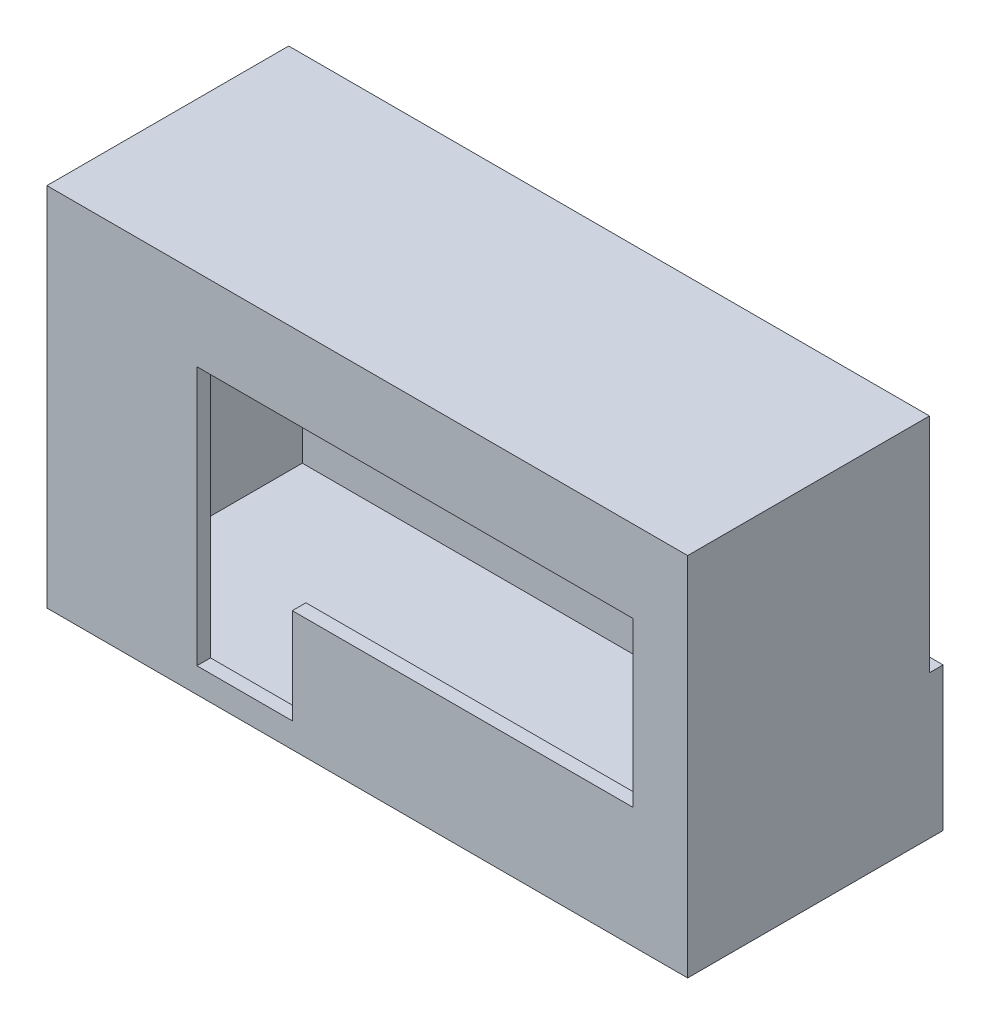
ISO-10303-21;
HEADER;
FILE_DESCRIPTION(('STEP AP214'),'2;1');
FILE_NAME('part.step','',(''),(''),'','','');
FILE_SCHEMA(('AUTOMOTIVE_DESIGN { 1 0 10303 214 1 1 1 1 }'));
ENDSEC;
DATA;
#1=APPLICATION_CONTEXT('core data for automotive mechanical design processes');
#2=APPLICATION_PROTOCOL_DEFINITION('international standard','automotive_design',2000,#1);
#3=PRODUCT_CONTEXT('',#1,'mechanical');
#4=PRODUCT('Part','Part','',(#3));
#5=PRODUCT_RELATED_PRODUCT_CATEGORY('part','',(#4));
#6=PRODUCT_DEFINITION_FORMATION('','',#4);
#7=PRODUCT_DEFINITION_CONTEXT('part definition',#1,'design');
#8=PRODUCT_DEFINITION('design','',#6,#7);
#9=PRODUCT_DEFINITION_SHAPE('','',#8);
#10=(LENGTH_UNIT() NAMED_UNIT(*) SI_UNIT(.MILLI.,.METRE.));
#11=(NAMED_UNIT(*) PLANE_ANGLE_UNIT() SI_UNIT($,.RADIAN.));
#12=(NAMED_UNIT(*) SI_UNIT($,.STERADIAN.) SOLID_ANGLE_UNIT());
#13=UNCERTAINTY_MEASURE_WITH_UNIT(LENGTH_MEASURE(1.E-05),#10,'distance_accuracy_value','');
#14=(GEOMETRIC_REPRESENTATION_CONTEXT(3) GLOBAL_UNCERTAINTY_ASSIGNED_CONTEXT((#13)) GLOBAL_UNIT_ASSIGNED_CONTEXT((#10,
#11,#12)) REPRESENTATION_CONTEXT('',''));
#15=CARTESIAN_POINT('',(0.,0.,0.));
#16=DIRECTION('',(0.,0.,1.));
#17=DIRECTION('',(1.,0.,0.));
#18=AXIS2_PLACEMENT_3D('',#15,#16,#17);
#19=CARTESIAN_POINT('',(-4500.,0.,-1673.50441924756));
#20=DIRECTION('',(0.,0.,1.));
#21=DIRECTION('',(1.,0.,0.));
#22=AXIS2_PLACEMENT_3D('',#19,#20,#21);
#23=PLANE('',#22);
#24=DIRECTION('',(1.,0.,0.));
#25=VECTOR('',#24,1.);
#26=CARTESIAN_POINT('',(100.,968.780178406409,-1673.50441924756));
#27=LINE('',#26,#25);
#28=CARTESIAN_POINT('',(-4600.,968.78017840641,-1673.50441924756));
#29=VERTEX_POINT('',#28);
#30=CARTESIAN_POINT('',(-4500.,968.78017840641,-1673.50441924756));
#31=VERTEX_POINT('',#30);
#32=EDGE_CURVE('E52',#29,#31,#27,.T.);
#33=ORIENTED_EDGE('',*,*,#32,.F.);
#34=DIRECTION('',(0.,-1.,0.));
#35=VECTOR('',#34,1.);
#36=CARTESIAN_POINT('',(-4600.,2500.,-1673.50441924756));
#37=LINE('',#36,#35);
#38=CARTESIAN_POINT('',(-4600.,2600.,-1673.50441924756));
#39=VERTEX_POINT('',#38);
#40=EDGE_CURVE('E226',#39,#29,#37,.T.);
#41=ORIENTED_EDGE('',*,*,#40,.F.);
#42=DIRECTION('',(-1.,0.,0.));
#43=VECTOR('',#42,1.);
#44=CARTESIAN_POINT('',(-4600.,2600.,-1673.50441924756));
#45=LINE('',#44,#43);
#46=CARTESIAN_POINT('',(100.,2600.,-1673.50441924756));
#47=VERTEX_POINT('',#46);
#48=EDGE_CURVE('E216',#47,#39,#45,.T.);
#49=ORIENTED_EDGE('',*,*,#48,.F.);
#50=DIRECTION('',(0.,1.,0.));
#51=VECTOR('',#50,1.);
#52=CARTESIAN_POINT('',(100.,2500.,-1673.50441924756));
#53=LINE('',#52,#51);
#54=CARTESIAN_POINT('',(100.,968.780178406409,-1673.50441924756));
#55=VERTEX_POINT('',#54);
#56=EDGE_CURVE('E172',#55,#47,#53,.T.);
#57=ORIENTED_EDGE('',*,*,#56,.F.);
#58=CARTESIAN_POINT('',(0.,968.780178406409,-1673.50441924756));
#59=VERTEX_POINT('',#58);
#60=EDGE_CURVE('E11',#59,#55,#27,.T.);
#61=ORIENTED_EDGE('',*,*,#60,.F.);
#62=DIRECTION('',(0.,1.,0.));
#63=VECTOR('',#62,1.);
#64=CARTESIAN_POINT('',(0.,2500.,-1673.50441924756));
#65=LINE('',#64,#63);
#66=CARTESIAN_POINT('',(0.,2500.,-1673.50441924756));
#67=VERTEX_POINT('',#66);
#68=EDGE_CURVE('E234',#59,#67,#65,.T.);
#69=ORIENTED_EDGE('',*,*,#68,.T.);
#70=DIRECTION('',(-1.,0.,0.));
#71=VECTOR('',#70,1.);
#72=CARTESIAN_POINT('',(-4600.,2500.,-1673.50441924756));
#73=LINE('',#72,#71);
#74=CARTESIAN_POINT('',(-4500.,2500.,-1673.50441924756));
#75=VERTEX_POINT('',#74);
#76=EDGE_CURVE('E203',#67,#75,#73,.T.);
#77=ORIENTED_EDGE('',*,*,#76,.T.);
#78=DIRECTION('',(0.,-1.,0.));
#79=VECTOR('',#78,1.);
#80=CARTESIAN_POINT('',(-4500.,2500.,-1673.50441924756));
#81=LINE('',#80,#79);
#82=EDGE_CURVE('E235',#75,#31,#81,.T.);
#83=ORIENTED_EDGE('',*,*,#82,.T.);
#84=EDGE_LOOP('',(#33,#41,#49,#57,#61,#69,#77,#83));
#85=FACE_BOUND('',#84,.T.);
#86=ADVANCED_FACE('F41',(#85),#23,.F.);
#87=CARTESIAN_POINT('',(0.,2000.,100.));
#88=DIRECTION('',(0.,1.,0.));
#89=DIRECTION('',(0.,0.,1.));
#90=AXIS2_PLACEMENT_3D('',#87,#88,#89);
#91=PLANE('',#90);
#92=DIRECTION('',(1.,0.,0.));
#93=VECTOR('',#92,1.);
#94=CARTESIAN_POINT('',(0.,2000.,0.));
#95=LINE('',#94,#93);
#96=CARTESIAN_POINT('',(-3500.,2000.,0.));
#97=VERTEX_POINT('',#96);
#98=CARTESIAN_POINT('',(-300.,2000.,0.));
#99=VERTEX_POINT('',#98);
#100=EDGE_CURVE('E307',#97,#99,#95,.T.);
#101=ORIENTED_EDGE('',*,*,#100,.T.);
#102=DIRECTION('',(0.,0.,-1.));
#103=VECTOR('',#102,1.);
#104=CARTESIAN_POINT('',(-300.,2000.,100.));
#105=LINE('',#104,#103);
#106=CARTESIAN_POINT('',(-300.,2000.,100.));
#107=VERTEX_POINT('',#106);
#108=EDGE_CURVE('E45',#107,#99,#105,.T.);
#109=ORIENTED_EDGE('',*,*,#108,.F.);
#110=DIRECTION('',(1.,0.,0.));
#111=VECTOR('',#110,1.);
#112=CARTESIAN_POINT('',(0.,2000.,100.));
#113=LINE('',#112,#111);
#114=CARTESIAN_POINT('',(-3500.,2000.,100.));
#115=VERTEX_POINT('',#114);
#116=EDGE_CURVE('E269',#115,#107,#113,.T.);
#117=ORIENTED_EDGE('',*,*,#116,.F.);
#118=DIRECTION('',(0.,0.,-1.));
#119=VECTOR('',#118,1.);
#120=CARTESIAN_POINT('',(-3500.,2000.,100.));
#121=LINE('',#120,#119);
#122=EDGE_CURVE('E292',#115,#97,#121,.T.);
#123=ORIENTED_EDGE('',*,*,#122,.T.);
#124=EDGE_LOOP('',(#101,#109,#117,#123));
#125=FACE_BOUND('',#124,.T.);
#126=ADVANCED_FACE('F43',(#125),#91,.F.);
#127=CARTESIAN_POINT('',(-300.,0.,100.));
#128=DIRECTION('',(1.,0.,0.));
#129=DIRECTION('',(0.,0.,-1.));
#130=AXIS2_PLACEMENT_3D('',#127,#128,#129);
#131=PLANE('',#130);
#132=DIRECTION('',(0.,-1.,0.));
#133=VECTOR('',#132,1.);
#134=CARTESIAN_POINT('',(-300.,0.,0.));
#135=LINE('',#134,#133);
#136=CARTESIAN_POINT('',(-300.,800.,0.));
#137=VERTEX_POINT('',#136);
#138=EDGE_CURVE('E311',#99,#137,#135,.T.);
#139=ORIENTED_EDGE('',*,*,#138,.T.);
#140=DIRECTION('',(0.,0.,-1.));
#141=VECTOR('',#140,1.);
#142=CARTESIAN_POINT('',(-300.,800.,100.));
#143=LINE('',#142,#141);
#144=CARTESIAN_POINT('',(-300.,800.,100.));
#145=VERTEX_POINT('',#144);
#146=EDGE_CURVE('E340',#145,#137,#143,.T.);
#147=ORIENTED_EDGE('',*,*,#146,.F.);
#148=DIRECTION('',(0.,-1.,0.));
#149=VECTOR('',#148,1.);
#150=CARTESIAN_POINT('',(-300.,0.,100.));
#151=LINE('',#150,#149);
#152=EDGE_CURVE('E273',#107,#145,#151,.T.);
#153=ORIENTED_EDGE('',*,*,#152,.F.);
#154=ORIENTED_EDGE('',*,*,#108,.T.);
#155=EDGE_LOOP('',(#139,#147,#153,#154));
#156=FACE_BOUND('',#155,.T.);
#157=ADVANCED_FACE('F349',(#156),#131,.F.);
#158=CARTESIAN_POINT('',(0.,800.,100.));
#159=DIRECTION('',(0.,1.,0.));
#160=DIRECTION('',(0.,0.,1.));
#161=AXIS2_PLACEMENT_3D('',#158,#159,#160);
#162=PLANE('',#161);
#163=DIRECTION('',(1.,0.,0.));
#164=VECTOR('',#163,1.);
#165=CARTESIAN_POINT('',(0.,800.,0.));
#166=LINE('',#165,#164);
#167=CARTESIAN_POINT('',(-2800.,800.,0.));
#168=VERTEX_POINT('',#167);
#169=EDGE_CURVE('E315',#168,#137,#166,.T.);
#170=ORIENTED_EDGE('',*,*,#169,.F.);
#171=DIRECTION('',(0.,0.,-1.));
#172=VECTOR('',#171,1.);
#173=CARTESIAN_POINT('',(-2800.,800.,100.));
#174=LINE('',#173,#172);
#175=CARTESIAN_POINT('',(-2800.,800.,100.));
#176=VERTEX_POINT('',#175);
#177=EDGE_CURVE('E338',#176,#168,#174,.T.);
#178=ORIENTED_EDGE('',*,*,#177,.F.);
#179=DIRECTION('',(1.,0.,0.));
#180=VECTOR('',#179,1.);
#181=CARTESIAN_POINT('',(0.,800.,100.));
#182=LINE('',#181,#180);
#183=EDGE_CURVE('E277',#176,#145,#182,.T.);
#184=ORIENTED_EDGE('',*,*,#183,.T.);
#185=ORIENTED_EDGE('',*,*,#146,.T.);
#186=EDGE_LOOP('',(#170,#178,#184,#185));
#187=FACE_BOUND('',#186,.T.);
#188=ADVANCED_FACE('F359',(#187),#162,.T.);
#189=CARTESIAN_POINT('',(-2800.,0.,100.));
#190=DIRECTION('',(-1.,0.,0.));
#191=DIRECTION('',(0.,0.,1.));
#192=AXIS2_PLACEMENT_3D('',#189,#190,#191);
#193=PLANE('',#192);
#194=DIRECTION('',(0.,1.,0.));
#195=VECTOR('',#194,1.);
#196=CARTESIAN_POINT('',(-2800.,0.,0.));
#197=LINE('',#196,#195);
#198=CARTESIAN_POINT('',(-2800.,99.9999999999996,0.));
#199=VERTEX_POINT('',#198);
#200=EDGE_CURVE('E319',#199,#168,#197,.T.);
#201=ORIENTED_EDGE('',*,*,#200,.F.);
#202=DIRECTION('',(0.,0.,-1.));
#203=VECTOR('',#202,1.);
#204=CARTESIAN_POINT('',(-2800.,99.9999999999996,100.));
#205=LINE('',#204,#203);
#206=CARTESIAN_POINT('',(-2800.,99.9999999999996,100.));
#207=VERTEX_POINT('',#206);
#208=EDGE_CURVE('E335',#207,#199,#205,.T.);
#209=ORIENTED_EDGE('',*,*,#208,.F.);
#210=DIRECTION('',(0.,1.,0.));
#211=VECTOR('',#210,1.);
#212=CARTESIAN_POINT('',(-2800.,0.,100.));
#213=LINE('',#212,#211);
#214=EDGE_CURVE('E281',#207,#176,#213,.T.);
#215=ORIENTED_EDGE('',*,*,#214,.T.);
#216=ORIENTED_EDGE('',*,*,#177,.T.);
#217=EDGE_LOOP('',(#201,#209,#215,#216));
#218=FACE_BOUND('',#217,.T.);
#219=ADVANCED_FACE('F366',(#218),#193,.T.);
#220=CARTESIAN_POINT('',(0.,99.9999999999996,100.));
#221=DIRECTION('',(0.,1.,0.));
#222=DIRECTION('',(0.,0.,1.));
#223=AXIS2_PLACEMENT_3D('',#220,#221,#222);
#224=PLANE('',#223);
#225=DIRECTION('',(1.,0.,0.));
#226=VECTOR('',#225,1.);
#227=CARTESIAN_POINT('',(0.,99.9999999999996,0.));
#228=LINE('',#227,#226);
#229=CARTESIAN_POINT('',(-3500.,99.9999999999996,0.));
#230=VERTEX_POINT('',#229);
#231=EDGE_CURVE('E323',#230,#199,#228,.T.);
#232=ORIENTED_EDGE('',*,*,#231,.F.);
#233=DIRECTION('',(0.,0.,-1.));
#234=VECTOR('',#233,1.);
#235=CARTESIAN_POINT('',(-3500.,99.9999999999996,100.));
#236=LINE('',#235,#234);
#237=CARTESIAN_POINT('',(-3500.,99.9999999999996,100.));
#238=VERTEX_POINT('',#237);
#239=EDGE_CURVE('E332',#238,#230,#236,.T.);
#240=ORIENTED_EDGE('',*,*,#239,.F.);
#241=DIRECTION('',(1.,0.,0.));
#242=VECTOR('',#241,1.);
#243=CARTESIAN_POINT('',(0.,99.9999999999996,100.));
#244=LINE('',#243,#242);
#245=EDGE_CURVE('E285',#238,#207,#244,.T.);
#246=ORIENTED_EDGE('',*,*,#245,.T.);
#247=ORIENTED_EDGE('',*,*,#208,.T.);
#248=EDGE_LOOP('',(#232,#240,#246,#247));
#249=FACE_BOUND('',#248,.T.);
#250=ADVANCED_FACE('F368',(#249),#224,.T.);
#251=CARTESIAN_POINT('',(-3500.,0.,100.));
#252=DIRECTION('',(-1.,0.,0.));
#253=DIRECTION('',(0.,0.,1.));
#254=AXIS2_PLACEMENT_3D('',#251,#252,#253);
#255=PLANE('',#254);
#256=DIRECTION('',(0.,1.,0.));
#257=VECTOR('',#256,1.);
#258=CARTESIAN_POINT('',(-3500.,0.,0.));
#259=LINE('',#258,#257);
#260=EDGE_CURVE('E274',#230,#97,#259,.T.);
#261=ORIENTED_EDGE('',*,*,#260,.T.);
#262=ORIENTED_EDGE('',*,*,#122,.F.);
#263=DIRECTION('',(0.,1.,0.));
#264=VECTOR('',#263,1.);
#265=CARTESIAN_POINT('',(-3500.,0.,100.));
#266=LINE('',#265,#264);
#267=EDGE_CURVE('E289',#238,#115,#266,.T.);
#268=ORIENTED_EDGE('',*,*,#267,.F.);
#269=ORIENTED_EDGE('',*,*,#239,.T.);
#270=EDGE_LOOP('',(#261,#262,#268,#269));
#271=FACE_BOUND('',#270,.T.);
#272=ADVANCED_FACE('F371',(#271),#255,.F.);
#273=CARTESIAN_POINT('',(0.,0.,100.));
#274=DIRECTION('',(0.,0.,1.));
#275=DIRECTION('',(1.,0.,0.));
#276=AXIS2_PLACEMENT_3D('',#273,#274,#275);
#277=PLANE('',#276);
#278=DIRECTION('',(0.,-1.,0.));
#279=VECTOR('',#278,1.);
#280=CARTESIAN_POINT('',(100.,2500.,100.));
#281=LINE('',#280,#279);
#282=CARTESIAN_POINT('',(100.,2600.,100.));
#283=VERTEX_POINT('',#282);
#284=CARTESIAN_POINT('',(100.,-83.5019370265056,100.));
#285=VERTEX_POINT('',#284);
#286=EDGE_CURVE('E169',#283,#285,#281,.T.);
#287=ORIENTED_EDGE('',*,*,#286,.F.);
#288=DIRECTION('',(1.,0.,0.));
#289=VECTOR('',#288,1.);
#290=CARTESIAN_POINT('',(-4600.,2600.,100.));
#291=LINE('',#290,#289);
#292=CARTESIAN_POINT('',(-4600.,2600.,100.));
#293=VERTEX_POINT('',#292);
#294=EDGE_CURVE('E208',#293,#283,#291,.T.);
#295=ORIENTED_EDGE('',*,*,#294,.F.);
#296=DIRECTION('',(0.,-1.,0.));
#297=VECTOR('',#296,1.);
#298=CARTESIAN_POINT('',(-4600.,2500.,100.));
#299=LINE('',#298,#297);
#300=CARTESIAN_POINT('',(-4600.,-83.5019370265056,100.));
#301=VERTEX_POINT('',#300);
#302=EDGE_CURVE('E230',#293,#301,#299,.T.);
#303=ORIENTED_EDGE('',*,*,#302,.T.);
#304=DIRECTION('',(1.,0.,0.));
#305=VECTOR('',#304,1.);
#306=CARTESIAN_POINT('',(-4500.,-83.5019370265056,100.));
#307=LINE('',#306,#305);
#308=EDGE_CURVE('E262',#301,#285,#307,.T.);
#309=ORIENTED_EDGE('',*,*,#308,.T.);
#310=EDGE_LOOP('',(#287,#295,#303,#309));
#311=FACE_BOUND('',#310,.T.);
#312=ORIENTED_EDGE('',*,*,#116,.T.);
#313=ORIENTED_EDGE('',*,*,#152,.T.);
#314=ORIENTED_EDGE('',*,*,#183,.F.);
#315=ORIENTED_EDGE('',*,*,#214,.F.);
#316=ORIENTED_EDGE('',*,*,#245,.F.);
#317=ORIENTED_EDGE('',*,*,#267,.T.);
#318=EDGE_LOOP('',(#312,#313,#314,#315,#316,#317));
#319=FACE_BOUND('',#318,.T.);
#320=ADVANCED_FACE('F364',(#311,#319),#277,.T.);
#321=CARTESIAN_POINT('',(0.,0.,0.));
#322=DIRECTION('',(0.,0.,1.));
#323=DIRECTION('',(1.,0.,0.));
#324=AXIS2_PLACEMENT_3D('',#321,#322,#323);
#325=PLANE('',#324);
#326=DIRECTION('',(0.,1.,0.));
#327=VECTOR('',#326,1.);
#328=CARTESIAN_POINT('',(-4500.,0.,0.));
#329=LINE('',#328,#327);
#330=CARTESIAN_POINT('',(-4500.,-5.51390728490488E-13,0.));
#331=VERTEX_POINT('',#330);
#332=CARTESIAN_POINT('',(-4500.,2500.,0.));
#333=VERTEX_POINT('',#332);
#334=EDGE_CURVE('E265',#331,#333,#329,.T.);
#335=ORIENTED_EDGE('',*,*,#334,.T.);
#336=DIRECTION('',(-1.,0.,0.));
#337=VECTOR('',#336,1.);
#338=CARTESIAN_POINT('',(2.46716227694479E-13,2500.,0.));
#339=LINE('',#338,#337);
#340=CARTESIAN_POINT('',(0.,2500.,0.));
#341=VERTEX_POINT('',#340);
#342=EDGE_CURVE('E303',#341,#333,#339,.T.);
#343=ORIENTED_EDGE('',*,*,#342,.F.);
#344=DIRECTION('',(0.,1.,0.));
#345=VECTOR('',#344,1.);
#346=CARTESIAN_POINT('',(0.,0.,0.));
#347=LINE('',#346,#345);
#348=CARTESIAN_POINT('',(0.,0.,0.));
#349=VERTEX_POINT('',#348);
#350=EDGE_CURVE('E299',#349,#341,#347,.T.);
#351=ORIENTED_EDGE('',*,*,#350,.F.);
#352=DIRECTION('',(-1.,0.,0.));
#353=VECTOR('',#352,1.);
#354=CARTESIAN_POINT('',(0.,0.,0.));
#355=LINE('',#354,#353);
#356=EDGE_CURVE('E295',#349,#331,#355,.T.);
#357=ORIENTED_EDGE('',*,*,#356,.T.);
#358=EDGE_LOOP('',(#335,#343,#351,#357));
#359=FACE_BOUND('',#358,.T.);
#360=ORIENTED_EDGE('',*,*,#100,.F.);
#361=ORIENTED_EDGE('',*,*,#260,.F.);
#362=ORIENTED_EDGE('',*,*,#231,.T.);
#363=ORIENTED_EDGE('',*,*,#200,.T.);
#364=ORIENTED_EDGE('',*,*,#169,.T.);
#365=ORIENTED_EDGE('',*,*,#138,.F.);
#366=EDGE_LOOP('',(#360,#361,#362,#363,#364,#365));
#367=FACE_BOUND('',#366,.T.);
#368=ADVANCED_FACE('F356',(#359,#367),#325,.F.);
#369=CARTESIAN_POINT('',(-4500.,-83.5019370265056,0.));
#370=DIRECTION('',(0.,-1.,0.));
#371=DIRECTION('',(0.,0.,-1.));
#372=AXIS2_PLACEMENT_3D('',#369,#370,#371);
#373=PLANE('',#372);
#374=DIRECTION('',(0.,0.,-1.));
#375=VECTOR('',#374,1.);
#376=CARTESIAN_POINT('',(-4600.,-83.5019370265056,100.));
#377=LINE('',#376,#375);
#378=CARTESIAN_POINT('',(-4600.,-83.5019370265056,-1773.50441924756));
#379=VERTEX_POINT('',#378);
#380=EDGE_CURVE('E178',#301,#379,#377,.T.);
#381=ORIENTED_EDGE('',*,*,#380,.T.);
#382=DIRECTION('',(-1.,0.,0.));
#383=VECTOR('',#382,1.);
#384=CARTESIAN_POINT('',(100.,-83.5019370265056,-1773.50441924756));
#385=LINE('',#384,#383);
#386=CARTESIAN_POINT('',(100.,-83.5019370265056,-1773.50441924756));
#387=VERTEX_POINT('',#386);
#388=EDGE_CURVE('E175',#387,#379,#385,.T.);
#389=ORIENTED_EDGE('',*,*,#388,.F.);
#390=DIRECTION('',(0.,0.,-1.));
#391=VECTOR('',#390,1.);
#392=CARTESIAN_POINT('',(100.,-83.5019370265056,100.));
#393=LINE('',#392,#391);
#394=EDGE_CURVE('E162',#285,#387,#393,.T.);
#395=ORIENTED_EDGE('',*,*,#394,.F.);
#396=ORIENTED_EDGE('',*,*,#308,.F.);
#397=EDGE_LOOP('',(#381,#389,#395,#396));
#398=FACE_BOUND('',#397,.T.);
#399=ADVANCED_FACE('F176',(#398),#373,.T.);
#400=CARTESIAN_POINT('',(-4500.,0.,0.));
#401=DIRECTION('',(0.,-1.,0.));
#402=DIRECTION('',(0.,0.,-1.));
#403=AXIS2_PLACEMENT_3D('',#400,#401,#402);
#404=PLANE('',#403);
#405=ORIENTED_EDGE('',*,*,#356,.F.);
#406=DIRECTION('',(0.,0.,-1.));
#407=VECTOR('',#406,1.);
#408=CARTESIAN_POINT('',(0.,0.,0.));
#409=LINE('',#408,#407);
#410=CARTESIAN_POINT('',(0.,0.,-1673.50441924756));
#411=VERTEX_POINT('',#410);
#412=EDGE_CURVE('E246',#349,#411,#409,.T.);
#413=ORIENTED_EDGE('',*,*,#412,.T.);
#414=DIRECTION('',(1.,0.,0.));
#415=VECTOR('',#414,1.);
#416=CARTESIAN_POINT('',(-4500.,0.,-1673.50441924756));
#417=LINE('',#416,#415);
#418=CARTESIAN_POINT('',(-4500.,4.44089209850063E-13,-1673.50441924756));
#419=VERTEX_POINT('',#418);
#420=EDGE_CURVE('E258',#419,#411,#417,.T.);
#421=ORIENTED_EDGE('',*,*,#420,.F.);
#422=DIRECTION('',(0.,0.,-1.));
#423=VECTOR('',#422,1.);
#424=CARTESIAN_POINT('',(-4500.,0.,0.));
#425=LINE('',#424,#423);
#426=EDGE_CURVE('E254',#331,#419,#425,.T.);
#427=ORIENTED_EDGE('',*,*,#426,.F.);
#428=EDGE_LOOP('',(#405,#413,#421,#427));
#429=FACE_BOUND('',#428,.T.);
#430=ADVANCED_FACE('F388',(#429),#404,.F.);
#431=CARTESIAN_POINT('',(0.,0.,0.));
#432=DIRECTION('',(1.,0.,0.));
#433=DIRECTION('',(0.,0.,-1.));
#434=AXIS2_PLACEMENT_3D('',#431,#432,#433);
#435=PLANE('',#434);
#436=ORIENTED_EDGE('',*,*,#412,.F.);
#437=ORIENTED_EDGE('',*,*,#350,.T.);
#438=DIRECTION('',(0.,0.,1.));
#439=VECTOR('',#438,1.);
#440=CARTESIAN_POINT('',(0.,2500.,100.));
#441=LINE('',#440,#439);
#442=EDGE_CURVE('E242',#67,#341,#441,.T.);
#443=ORIENTED_EDGE('',*,*,#442,.F.);
#444=ORIENTED_EDGE('',*,*,#68,.F.);
#445=EDGE_CURVE('E247',#411,#59,#65,.T.);
#446=ORIENTED_EDGE('',*,*,#445,.F.);
#447=EDGE_LOOP('',(#436,#437,#443,#444,#446));
#448=FACE_BOUND('',#447,.T.);
#449=ADVANCED_FACE('F406',(#448),#435,.F.);
#450=CARTESIAN_POINT('',(100.,0.,0.));
#451=DIRECTION('',(1.,0.,0.));
#452=DIRECTION('',(0.,0.,-1.));
#453=AXIS2_PLACEMENT_3D('',#450,#451,#452);
#454=PLANE('',#453);
#455=ORIENTED_EDGE('',*,*,#286,.T.);
#456=ORIENTED_EDGE('',*,*,#394,.T.);
#457=DIRECTION('',(0.,-1.,0.));
#458=VECTOR('',#457,1.);
#459=CARTESIAN_POINT('',(100.,-83.5019370265056,-1773.50441924756));
#460=LINE('',#459,#458);
#461=CARTESIAN_POINT('',(100.,968.780178406409,-1773.50441924756));
#462=VERTEX_POINT('',#461);
#463=EDGE_CURVE('E167',#462,#387,#460,.T.);
#464=ORIENTED_EDGE('',*,*,#463,.F.);
#465=DIRECTION('',(0.,0.,1.));
#466=VECTOR('',#465,1.);
#467=CARTESIAN_POINT('',(100.,968.780178406409,-1773.50441924756));
#468=LINE('',#467,#466);
#469=EDGE_CURVE('E195',#462,#55,#468,.T.);
#470=ORIENTED_EDGE('',*,*,#469,.T.);
#471=ORIENTED_EDGE('',*,*,#56,.T.);
#472=DIRECTION('',(0.,0.,-1.));
#473=VECTOR('',#472,1.);
#474=CARTESIAN_POINT('',(100.,2600.,-1673.50441924756));
#475=LINE('',#474,#473);
#476=EDGE_CURVE('E212',#283,#47,#475,.T.);
#477=ORIENTED_EDGE('',*,*,#476,.F.);
#478=EDGE_LOOP('',(#455,#456,#464,#470,#471,#477));
#479=FACE_BOUND('',#478,.T.);
#480=ADVANCED_FACE('F164',(#479),#454,.T.);
#481=CARTESIAN_POINT('',(-4600.,0.,0.));
#482=DIRECTION('',(-1.,0.,0.));
#483=DIRECTION('',(0.,0.,1.));
#484=AXIS2_PLACEMENT_3D('',#481,#482,#483);
#485=PLANE('',#484);
#486=ORIENTED_EDGE('',*,*,#380,.F.);
#487=ORIENTED_EDGE('',*,*,#302,.F.);
#488=DIRECTION('',(0.,0.,1.));
#489=VECTOR('',#488,1.);
#490=CARTESIAN_POINT('',(-4600.,2600.,-1673.50441924756));
#491=LINE('',#490,#489);
#492=EDGE_CURVE('E204',#39,#293,#491,.T.);
#493=ORIENTED_EDGE('',*,*,#492,.F.);
#494=ORIENTED_EDGE('',*,*,#40,.T.);
#495=DIRECTION('',(0.,0.,1.));
#496=VECTOR('',#495,1.);
#497=CARTESIAN_POINT('',(-4600.,968.780178406409,-1773.50441924756));
#498=LINE('',#497,#496);
#499=CARTESIAN_POINT('',(-4600.,968.780178406409,-1773.50441924756));
#500=VERTEX_POINT('',#499);
#501=EDGE_CURVE('E199',#500,#29,#498,.T.);
#502=ORIENTED_EDGE('',*,*,#501,.F.);
#503=DIRECTION('',(0.,1.,0.));
#504=VECTOR('',#503,1.);
#505=CARTESIAN_POINT('',(-4600.,-83.5019370265056,-1773.50441924756));
#506=LINE('',#505,#504);
#507=EDGE_CURVE('E182',#379,#500,#506,.T.);
#508=ORIENTED_EDGE('',*,*,#507,.F.);
#509=EDGE_LOOP('',(#486,#487,#493,#494,#502,#508));
#510=FACE_BOUND('',#509,.T.);
#511=ADVANCED_FACE('F420',(#510),#485,.T.);
#512=CARTESIAN_POINT('',(-4500.,0.,0.));
#513=DIRECTION('',(-1.,0.,0.));
#514=DIRECTION('',(0.,0.,1.));
#515=AXIS2_PLACEMENT_3D('',#512,#513,#514);
#516=PLANE('',#515);
#517=ORIENTED_EDGE('',*,*,#334,.F.);
#518=ORIENTED_EDGE('',*,*,#426,.T.);
#519=EDGE_CURVE('E220',#31,#419,#81,.T.);
#520=ORIENTED_EDGE('',*,*,#519,.F.);
#521=ORIENTED_EDGE('',*,*,#82,.F.);
#522=DIRECTION('',(0.,0.,-1.));
#523=VECTOR('',#522,1.);
#524=CARTESIAN_POINT('',(-4500.,2500.,100.));
#525=LINE('',#524,#523);
#526=EDGE_CURVE('E227',#333,#75,#525,.T.);
#527=ORIENTED_EDGE('',*,*,#526,.F.);
#528=EDGE_LOOP('',(#517,#518,#520,#521,#527));
#529=FACE_BOUND('',#528,.T.);
#530=ADVANCED_FACE('F400',(#529),#516,.F.);
#531=CARTESIAN_POINT('',(2.36217664813863E-13,2500.,0.));
#532=DIRECTION('',(0.,1.,0.));
#533=DIRECTION('',(-1.,0.,0.));
#534=AXIS2_PLACEMENT_3D('',#531,#532,#533);
#535=PLANE('',#534);
#536=ORIENTED_EDGE('',*,*,#342,.T.);
#537=ORIENTED_EDGE('',*,*,#526,.T.);
#538=ORIENTED_EDGE('',*,*,#76,.F.);
#539=ORIENTED_EDGE('',*,*,#442,.T.);
#540=EDGE_LOOP('',(#536,#537,#538,#539));
#541=FACE_BOUND('',#540,.T.);
#542=ADVANCED_FACE('F403',(#541),#535,.F.);
#543=CARTESIAN_POINT('',(2.46086313921642E-13,2600.,0.));
#544=DIRECTION('',(0.,1.,0.));
#545=DIRECTION('',(-1.,0.,0.));
#546=AXIS2_PLACEMENT_3D('',#543,#544,#545);
#547=PLANE('',#546);
#548=ORIENTED_EDGE('',*,*,#492,.T.);
#549=ORIENTED_EDGE('',*,*,#294,.T.);
#550=ORIENTED_EDGE('',*,*,#476,.T.);
#551=ORIENTED_EDGE('',*,*,#48,.T.);
#552=EDGE_LOOP('',(#548,#549,#550,#551));
#553=FACE_BOUND('',#552,.T.);
#554=ADVANCED_FACE('F424',(#553),#547,.T.);
#555=CARTESIAN_POINT('',(100.,968.780178406409,-1773.50441924756));
#556=DIRECTION('',(0.,-1.,0.));
#557=DIRECTION('',(0.,0.,-1.));
#558=AXIS2_PLACEMENT_3D('',#555,#556,#557);
#559=PLANE('',#558);
#560=ORIENTED_EDGE('',*,*,#32,.T.);
#561=EDGE_CURVE('E53',#31,#59,#27,.T.);
#562=ORIENTED_EDGE('',*,*,#561,.T.);
#563=ORIENTED_EDGE('',*,*,#60,.T.);
#564=ORIENTED_EDGE('',*,*,#469,.F.);
#565=DIRECTION('',(1.,0.,0.));
#566=VECTOR('',#565,1.);
#567=CARTESIAN_POINT('',(100.,968.780178406409,-1773.50441924756));
#568=LINE('',#567,#566);
#569=EDGE_CURVE('E186',#500,#462,#568,.T.);
#570=ORIENTED_EDGE('',*,*,#569,.F.);
#571=ORIENTED_EDGE('',*,*,#501,.T.);
#572=EDGE_LOOP('',(#560,#562,#563,#564,#570,#571));
#573=FACE_BOUND('',#572,.T.);
#574=ADVANCED_FACE('F417',(#573),#559,.F.);
#575=CARTESIAN_POINT('',(0.,0.,-1773.50441924756));
#576=DIRECTION('',(0.,0.,1.));
#577=DIRECTION('',(1.,0.,0.));
#578=AXIS2_PLACEMENT_3D('',#575,#576,#577);
#579=PLANE('',#578);
#580=ORIENTED_EDGE('',*,*,#463,.T.);
#581=ORIENTED_EDGE('',*,*,#388,.T.);
#582=ORIENTED_EDGE('',*,*,#507,.T.);
#583=ORIENTED_EDGE('',*,*,#569,.T.);
#584=EDGE_LOOP('',(#580,#581,#582,#583));
#585=FACE_BOUND('',#584,.T.);
#586=ADVANCED_FACE('F184',(#585),#579,.F.);
#587=CARTESIAN_POINT('',(0.,0.,-1673.50441924756));
#588=DIRECTION('',(0.,0.,1.));
#589=DIRECTION('',(1.,0.,0.));
#590=AXIS2_PLACEMENT_3D('',#587,#588,#589);
#591=PLANE('',#590);
#592=ORIENTED_EDGE('',*,*,#561,.F.);
#593=ORIENTED_EDGE('',*,*,#519,.T.);
#594=ORIENTED_EDGE('',*,*,#420,.T.);
#595=ORIENTED_EDGE('',*,*,#445,.T.);
#596=EDGE_LOOP('',(#592,#593,#594,#595));
#597=FACE_BOUND('',#596,.T.);
#598=ADVANCED_FACE('F411',(#597),#591,.T.);
#599=CLOSED_SHELL('',(#86,#126,#157,#188,#219,#250,#272,#320,#368,#399,#430,#449,#480,#511,#530,
#542,#554,#574,#586,#598));
#600=MANIFOLD_SOLID_BREP('B2',#599);
#601=ADVANCED_BREP_SHAPE_REPRESENTATION('',(#18,#600),#14);
#602=SHAPE_DEFINITION_REPRESENTATION(#9,#601);
ENDSEC;
END-ISO-10303-21;
